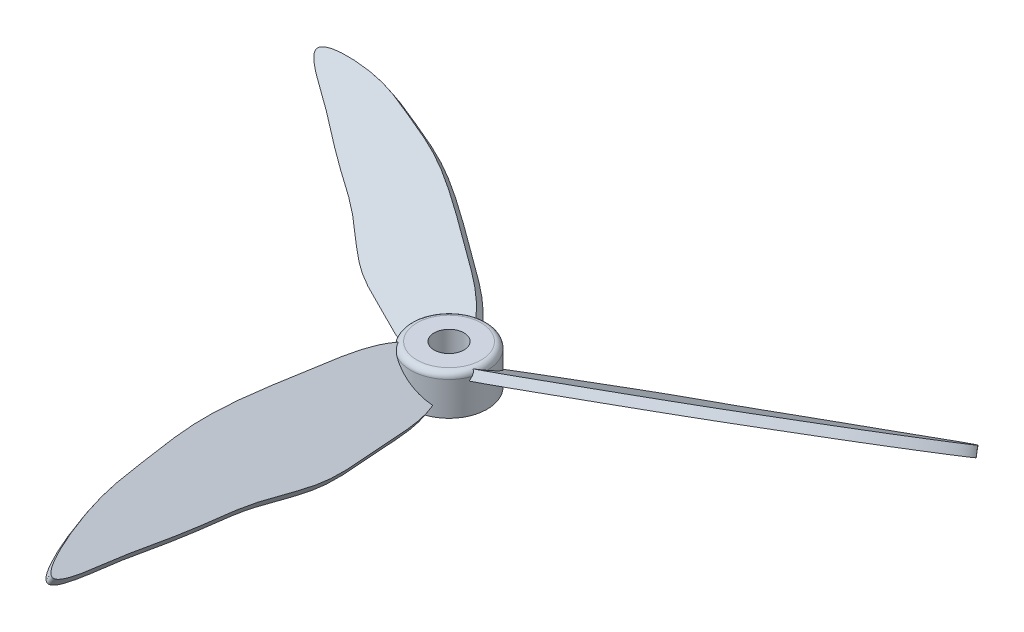
ISO-10303-21;
HEADER;
FILE_DESCRIPTION(('STEP AP214'),'2;1');
FILE_NAME('part.step','',(''),(''),'','','');
FILE_SCHEMA(('AUTOMOTIVE_DESIGN { 1 0 10303 214 1 1 1 1 }'));
ENDSEC;
DATA;
#1=APPLICATION_CONTEXT('core data for automotive mechanical design processes');
#2=APPLICATION_PROTOCOL_DEFINITION('international standard','automotive_design',2000,#1);
#3=PRODUCT_CONTEXT('',#1,'mechanical');
#4=PRODUCT('Part','Part','',(#3));
#5=PRODUCT_RELATED_PRODUCT_CATEGORY('part','',(#4));
#6=PRODUCT_DEFINITION_FORMATION('','',#4);
#7=PRODUCT_DEFINITION_CONTEXT('part definition',#1,'design');
#8=PRODUCT_DEFINITION('design','',#6,#7);
#9=PRODUCT_DEFINITION_SHAPE('','',#8);
#10=(LENGTH_UNIT() NAMED_UNIT(*) SI_UNIT(.MILLI.,.METRE.));
#11=(NAMED_UNIT(*) PLANE_ANGLE_UNIT() SI_UNIT($,.RADIAN.));
#12=(NAMED_UNIT(*) SI_UNIT($,.STERADIAN.) SOLID_ANGLE_UNIT());
#13=UNCERTAINTY_MEASURE_WITH_UNIT(LENGTH_MEASURE(1.E-05),#10,'distance_accuracy_value','');
#14=(GEOMETRIC_REPRESENTATION_CONTEXT(3) GLOBAL_UNCERTAINTY_ASSIGNED_CONTEXT((#13)) GLOBAL_UNIT_ASSIGNED_CONTEXT((#10,
#11,#12)) REPRESENTATION_CONTEXT('',''));
#15=CARTESIAN_POINT('',(0.,0.,0.));
#16=DIRECTION('',(0.,0.,1.));
#17=DIRECTION('',(1.,0.,0.));
#18=AXIS2_PLACEMENT_3D('',#15,#16,#17);
#19=CARTESIAN_POINT('',(0.,6.6,0.));
#20=DIRECTION('',(0.,-1.,0.));
#21=DIRECTION('',(0.,0.,-1.));
#22=AXIS2_PLACEMENT_3D('',#19,#20,#21);
#23=CYLINDRICAL_SURFACE('',#22,6.35);
#24=CARTESIAN_POINT('',(-4.49680921276175,6.96491194591247,4.48343695216304));
#25=CARTESIAN_POINT('',(-4.52350714899534,6.90405572449258,4.45665929181071));
#26=CARTESIAN_POINT('',(-4.54998357817205,6.84321590244583,4.42962555978286));
#27=CARTESIAN_POINT('',(-4.60247920744315,6.72157889389337,4.37505643094239));
#28=CARTESIAN_POINT('',(-4.62849848745034,6.66078170175607,4.34752112355762));
#29=CARTESIAN_POINT('',(-4.72847204521192,6.42514892680272,4.23980440725148));
#30=CARTESIAN_POINT('',(-4.80074566608385,6.25042604326687,4.15780178520276));
#31=CARTESIAN_POINT('',(-4.94125481306203,5.90115444346269,3.98980072588375));
#32=CARTESIAN_POINT('',(-5.00948826873559,5.72660586079776,3.9038002794927));
#33=CARTESIAN_POINT('',(-5.07555734179139,5.55219210498289,3.81591636048113));
#34=B_SPLINE_CURVE_WITH_KNOTS('',3,(#24,#25,#26,#27,#28,#29,#30,#31,#32,#33),.UNSPECIFIED.,.F.,
.F.,(4,2,2,2,4),(0.,0.214938866298417,0.429839778286765,1.04804647547726,1.6665672862245),.UNSPECIFIED.);
#35=CARTESIAN_POINT('',(-4.86124815456972,6.1,4.0854334384117));
#36=VERTEX_POINT('',#35);
#37=CARTESIAN_POINT('',(-5.07555734179139,5.55219210498289,3.81591636048113));
#38=VERTEX_POINT('',#37);
#39=EDGE_CURVE('E136',#36,#38,#34,.T.);
#40=ORIENTED_EDGE('',*,*,#39,.F.);
#41=CARTESIAN_POINT('',(0.,6.1,0.));
#42=DIRECTION('',(0.,1.,0.));
#43=DIRECTION('',(0.,0.,1.));
#44=AXIS2_PLACEMENT_3D('',#41,#42,#43);
#45=CIRCLE('',#44,6.35);
#46=CARTESIAN_POINT('',(-3.18487036983878,6.1,-5.49355083050325));
#47=VERTEX_POINT('',#46);
#48=EDGE_CURVE('E254',#36,#47,#45,.F.);
#49=ORIENTED_EDGE('',*,*,#48,.T.);
#50=CARTESIAN_POINT('',(0.,4.04430390051049,0.));
#51=DIRECTION('',(0.272342210396155,-0.83864109233101,-0.471710545451748));
#52=DIRECTION('',(-0.419320546165509,-0.544684420792306,0.726284490616184));
#53=AXIS2_PLACEMENT_3D('',#50,#51,#52);
#54=ELLIPSE('',#53,7.57177302432214,6.35);
#55=CARTESIAN_POINT('',(-6.3435516702184,2.14520625579199,-0.286098247581657));
#56=VERTEX_POINT('',#55);
#57=EDGE_CURVE('E147',#56,#47,#54,.T.);
#58=ORIENTED_EDGE('',*,*,#57,.F.);
#59=CARTESIAN_POINT('',(-6.25886890307674,0.826112254287706,-1.07194218785298));
#60=CARTESIAN_POINT('',(-6.2663210773202,0.899290521177855,-1.02843043538216));
#61=CARTESIAN_POINT('',(-6.27331337155988,0.972490572230304,-0.984876633269169));
#62=CARTESIAN_POINT('',(-6.28637866662306,1.11891519403977,-0.897710926041318));
#63=CARTESIAN_POINT('',(-6.29245187835954,1.1921397552948,-0.854099036580959));
#64=CARTESIAN_POINT('',(-6.30368225776288,1.33861962922464,-0.766828115727283));
#65=CARTESIAN_POINT('',(-6.30883952989446,1.41187493743623,-0.723169090282081));
#66=CARTESIAN_POINT('',(-6.31824091223512,1.55842293374281,-0.63581564403103));
#67=CARTESIAN_POINT('',(-6.32248502330798,1.63171562180239,-0.592121223258702));
#68=CARTESIAN_POINT('',(-6.33006267628444,1.77834560737756,-0.504709081959201));
#69=CARTESIAN_POINT('',(-6.33339611333917,1.8516829090563,-0.460991359329291));
#70=CARTESIAN_POINT('',(-6.33915485805162,1.99840975805865,-0.373545573427742));
#71=CARTESIAN_POINT('',(-6.3415799578465,2.07179931349502,-0.329817510077791));
#72=CARTESIAN_POINT('',(-6.34355167021854,2.14520625579199,-0.286098247581673));
#73=B_SPLINE_CURVE_WITH_KNOTS('',3,(#59,#60,#61,#62,#63,#64,#65,#66,#67,#68,#69,#70,#71,#72),
.UNSPECIFIED.,.F.,.F.,(4,2,2,2,2,2,4),(0.,0.256386672841968,0.512714420021286,0.769012913712203,
1.02531116496313,1.28163891224845,1.53802528149063),.UNSPECIFIED.);
#74=CARTESIAN_POINT('',(-6.25886890307674,0.826112254287706,-1.07194218785298));
#75=VERTEX_POINT('',#74);
#76=EDGE_CURVE('E309',#75,#56,#73,.T.);
#77=ORIENTED_EDGE('',*,*,#76,.F.);
#78=CARTESIAN_POINT('',(0.,2.25569609948951,0.));
#79=DIRECTION('',(0.272342210396155,-0.83864109233101,-0.471710545451748));
#80=DIRECTION('',(-0.419320546165509,-0.544684420792306,0.726284490616184));
#81=AXIS2_PLACEMENT_3D('',#78,#79,#80);
#82=ELLIPSE('',#81,7.57177302432214,6.35);
#83=CARTESIAN_POINT('',(-0.76690183599759,5.55219210498288,-6.30351977659653));
#84=VERTEX_POINT('',#83);
#85=EDGE_CURVE('E141',#75,#84,#82,.T.);
#86=ORIENTED_EDGE('',*,*,#85,.T.);
#87=CARTESIAN_POINT('',(-1.63436569045816,6.96491194591246,-6.13606949030511));
#88=CARTESIAN_POINT('',(-1.59782658822234,6.90405572449258,-6.14580175113585));
#89=CARTESIAN_POINT('',(-1.56117647493877,6.84321590244582,-6.15521414539046));
#90=CARTESIAN_POINT('',(-1.48767040846498,6.72157889389337,-6.17339212950664));
#91=CARTESIAN_POINT('',(-1.45081449276517,6.66078170175607,-6.18215783328866));
#92=CARTESIAN_POINT('',(-1.30754230115101,6.42514892680272,-6.21487911586382));
#93=CARTESIAN_POINT('',(-1.20038913684392,6.25042604326687,-6.23646859653804));
#94=CARTESIAN_POINT('',(-0.984641378121879,5.90115444346269,-6.27415255762573));
#95=CARTESIAN_POINT('',(-0.876046078973651,5.72660586079775,-6.29024424043151));
#96=CARTESIAN_POINT('',(-0.766901835997591,5.55219210498289,-6.30351977659654));
#97=B_SPLINE_CURVE_WITH_KNOTS('',3,(#87,#88,#89,#90,#91,#92,#93,#94,#95,#96),.UNSPECIFIED.,.F.,
.F.,(4,2,2,2,4),(0.,0.214938866298417,0.429839778286765,1.04804647547726,1.6665672862245),.UNSPECIFIED.);
#98=CARTESIAN_POINT('',(-1.10746506585005,6.1,-6.25268111516346));
#99=VERTEX_POINT('',#98);
#100=EDGE_CURVE('E314',#99,#84,#97,.T.);
#101=ORIENTED_EDGE('',*,*,#100,.F.);
#102=CARTESIAN_POINT('',(0.,6.1,0.));
#103=DIRECTION('',(0.,1.,0.));
#104=DIRECTION('',(0.,0.,1.));
#105=AXIS2_PLACEMENT_3D('',#102,#103,#104);
#106=CIRCLE('',#105,6.35);
#107=CARTESIAN_POINT('',(6.34998976111631,6.1,-0.0114032327890717));
#108=VERTEX_POINT('',#107);
#109=EDGE_CURVE('E251',#99,#108,#106,.F.);
#110=ORIENTED_EDGE('',*,*,#109,.T.);
#111=CARTESIAN_POINT('',(0.,4.04430390051049,0.));
#112=DIRECTION('',(0.272342210396148,-0.83864109233101,0.471710545451752));
#113=DIRECTION('',(-0.419320546165499,-0.544684420792306,-0.72628449061619));
#114=AXIS2_PLACEMENT_3D('',#111,#112,#113);
#115=ELLIPSE('',#114,7.57177302432214,6.35);
#116=CARTESIAN_POINT('',(3.41954418549315,2.14520625579199,-5.3506277728375));
#117=VERTEX_POINT('',#116);
#118=EDGE_CURVE('E209',#117,#108,#115,.T.);
#119=ORIENTED_EDGE('',*,*,#118,.F.);
#120=CARTESIAN_POINT('',(4.05776361760734,0.826112254287706,-4.88436837509439));
#121=CARTESIAN_POINT('',(4.02380742172617,0.899290521177854,-4.91257802353807));
#122=CARTESIAN_POINT('',(3.98958486978475,0.972490572230304,-4.94041042903686));
#123=CARTESIAN_POINT('',(3.92062980051819,1.11891519403977,-4.99530816008344));
#124=CARTESIAN_POINT('',(3.88589740220672,1.1921397552948,-5.02237366045997));
#125=CARTESIAN_POINT('',(3.81593375743744,1.33861962922464,-5.07573491474424));
#126=CARTESIAN_POINT('',(3.78070256836322,1.41187493743622,-5.10203075614702));
#127=CARTESIAN_POINT('',(3.70975295597202,1.55842293374281,-5.15384931521025));
#128=CARTESIAN_POINT('',(3.67403453311597,1.63171562180239,-5.17937203360199));
#129=CARTESIAN_POINT('',(3.60212222463964,1.77834560737756,-5.22964054423042));
#130=CARTESIAN_POINT('',(3.5659282847739,1.8516829090563,-5.25438624671669));
#131=CARTESIAN_POINT('',(3.49307738508548,1.99840975805865,-5.30309635888235));
#132=CARTESIAN_POINT('',(3.45642032126357,2.07179931349502,-5.32706058858641));
#133=CARTESIAN_POINT('',(3.41954418549323,2.14520625579199,-5.35062777283761));
#134=B_SPLINE_CURVE_WITH_KNOTS('',3,(#120,#121,#122,#123,#124,#125,#126,#127,#128,#129,#130,
#131,#132,#133),.UNSPECIFIED.,.F.,.F.,(4,2,2,2,2,2,4),(0.,0.256386672841969,0.512714420021286,
0.769012913712203,1.02531116496313,1.28163891224845,1.53802528149062),.UNSPECIFIED.);
#135=CARTESIAN_POINT('',(4.05776361760734,0.826112254287706,-4.88436837509439));
#136=VERTEX_POINT('',#135);
#137=EDGE_CURVE('E230',#136,#117,#134,.T.);
#138=ORIENTED_EDGE('',*,*,#137,.F.);
#139=CARTESIAN_POINT('',(0.,2.25569609948951,0.));
#140=DIRECTION('',(0.272342210396148,-0.83864109233101,0.471710545451752));
#141=DIRECTION('',(-0.419320546165499,-0.544684420792306,-0.72628449061619));
#142=AXIS2_PLACEMENT_3D('',#139,#140,#141);
#143=ELLIPSE('',#142,7.57177302432214,6.35);
#144=CARTESIAN_POINT('',(5.84245917778898,5.55219210498289,2.48760341611545));
#145=VERTEX_POINT('',#144);
#146=EDGE_CURVE('E293',#136,#145,#143,.T.);
#147=ORIENTED_EDGE('',*,*,#146,.T.);
#148=CARTESIAN_POINT('',(6.13117490321993,6.96491194591246,1.65263253814212));
#149=CARTESIAN_POINT('',(6.12133373721769,6.90405572449258,1.68914245932519));
#150=CARTESIAN_POINT('',(6.11116005311083,6.84321590244582,1.72558858560764));
#151=CARTESIAN_POINT('',(6.09014961590815,6.72157889389337,1.7983356985643));
#152=CARTESIAN_POINT('',(6.07931298021552,6.66078170175607,1.83463670973109));
#153=CARTESIAN_POINT('',(6.03601434636295,6.42514892680272,1.9750747086124));
#154=CARTESIAN_POINT('',(6.00113480292778,6.25042604326687,2.07866681133533));
#155=CARTESIAN_POINT('',(5.92589619118391,5.90115444346269,2.28435183174202));
#156=CARTESIAN_POINT('',(5.88553434770925,5.72660586079775,2.38644396093885));
#157=CARTESIAN_POINT('',(5.84245917778899,5.55219210498289,2.48760341611545));
#158=B_SPLINE_CURVE_WITH_KNOTS('',3,(#148,#149,#150,#151,#152,#153,#154,#155,#156,#157),
.UNSPECIFIED.,.F.,.F.,(4,2,2,2,4),(0.,0.214938866298415,0.429839778286762,1.04804647547726,
1.6665672862245),.UNSPECIFIED.);
#159=CARTESIAN_POINT('',(5.96871322041978,6.1,2.1672476767518));
#160=VERTEX_POINT('',#159);
#161=EDGE_CURVE('E238',#160,#145,#158,.T.);
#162=ORIENTED_EDGE('',*,*,#161,.F.);
#163=CARTESIAN_POINT('',(0.,6.1,0.));
#164=DIRECTION('',(0.,1.,0.));
#165=DIRECTION('',(0.,0.,1.));
#166=AXIS2_PLACEMENT_3D('',#163,#164,#165);
#167=CIRCLE('',#166,6.35);
#168=CARTESIAN_POINT('',(-3.1651193912775,6.1,5.50495406329237));
#169=VERTEX_POINT('',#168);
#170=EDGE_CURVE('E125',#160,#169,#167,.F.);
#171=ORIENTED_EDGE('',*,*,#170,.T.);
#172=CARTESIAN_POINT('',(0.,4.04430390051049,0.));
#173=DIRECTION('',(-0.544684420792306,-0.83864109233101,0.));
#174=DIRECTION('',(0.838641092331011,-0.544684420792306,0.));
#175=AXIS2_PLACEMENT_3D('',#172,#173,#174);
#176=ELLIPSE('',#175,7.57177302432214,6.35);
#177=CARTESIAN_POINT('',(2.9240074847253,2.14520625579199,5.63672602041916));
#178=VERTEX_POINT('',#177);
#179=EDGE_CURVE('E117',#178,#169,#176,.T.);
#180=ORIENTED_EDGE('',*,*,#179,.F.);
#181=CARTESIAN_POINT('',(2.20110528546944,0.826112254287706,5.95631056294738));
#182=CARTESIAN_POINT('',(2.24251365559408,0.899290521177854,5.94100845892024));
#183=CARTESIAN_POINT('',(2.28372850177518,0.972490572230304,5.92528706230604));
#184=CARTESIAN_POINT('',(2.36574886610492,1.11891519403977,5.89301908612476));
#185=CARTESIAN_POINT('',(2.40655447615287,1.1921397552948,5.87647269704094));
#186=CARTESIAN_POINT('',(2.48774850032549,1.33861962922464,5.84256303047153));
#187=CARTESIAN_POINT('',(2.52813696153129,1.41187493743623,5.82519984642911));
#188=CARTESIAN_POINT('',(2.60848795626315,1.55842293374281,5.78966495924129));
#189=CARTESIAN_POINT('',(2.64845049019206,1.63171562180239,5.77149325686069));
#190=CARTESIAN_POINT('',(2.72794045164486,1.77834560737756,5.73434962618963));
#191=CARTESIAN_POINT('',(2.76746782856533,1.8516829090563,5.71537760604598));
#192=CARTESIAN_POINT('',(2.84607747296619,1.99840975805865,5.6766419323101));
#193=CARTESIAN_POINT('',(2.88515963658298,2.07179931349502,5.6568780986642));
#194=CARTESIAN_POINT('',(2.92400748472536,2.14520625579199,5.63672602041929));
#195=B_SPLINE_CURVE_WITH_KNOTS('',3,(#181,#182,#183,#184,#185,#186,#187,#188,#189,#190,#191,
#192,#193,#194),.UNSPECIFIED.,.F.,.F.,(4,2,2,2,2,2,4),(0.,0.256386672841969,0.512714420021287,
0.769012913712204,1.02531116496313,1.28163891224845,1.53802528149063),.UNSPECIFIED.);
#196=CARTESIAN_POINT('',(2.20110528546944,0.826112254287706,5.95631056294738));
#197=VERTEX_POINT('',#196);
#198=EDGE_CURVE('E121',#197,#178,#195,.T.);
#199=ORIENTED_EDGE('',*,*,#198,.F.);
#200=CARTESIAN_POINT('',(0.,2.25569609948951,0.));
#201=DIRECTION('',(-0.544684420792306,-0.83864109233101,0.));
#202=DIRECTION('',(0.838641092331011,-0.544684420792306,0.));
#203=AXIS2_PLACEMENT_3D('',#200,#201,#202);
#204=ELLIPSE('',#203,7.57177302432214,6.35);
#205=EDGE_CURVE('E129',#197,#38,#204,.T.);
#206=ORIENTED_EDGE('',*,*,#205,.T.);
#207=EDGE_LOOP('',(#40,#49,#58,#77,#86,#101,#110,#119,#138,#147,#162,#171,#180,#199,#206));
#208=FACE_BOUND('',#207,.T.);
#209=CARTESIAN_POINT('',(0.,0.5,0.));
#210=DIRECTION('',(0.,-1.,0.));
#211=DIRECTION('',(0.,0.,-1.));
#212=AXIS2_PLACEMENT_3D('',#209,#210,#211);
#213=CIRCLE('',#212,6.35);
#214=CARTESIAN_POINT('',(0.,0.5,-6.35));
#215=VERTEX_POINT('',#214);
#216=EDGE_CURVE('E194',#215,#215,#213,.T.);
#217=ORIENTED_EDGE('',*,*,#216,.F.);
#218=EDGE_LOOP('',(#217));
#219=FACE_BOUND('',#218,.T.);
#220=ADVANCED_FACE('F39',(#208,#219),#23,.T.);
#221=CARTESIAN_POINT('',(0.,6.6,0.));
#222=DIRECTION('',(0.,-1.,0.));
#223=DIRECTION('',(0.,0.,-1.));
#224=AXIS2_PLACEMENT_3D('',#221,#222,#223);
#225=CYLINDRICAL_SURFACE('',#224,2.48);
#226=CARTESIAN_POINT('',(0.,7.1,0.));
#227=DIRECTION('',(0.,1.,0.));
#228=DIRECTION('',(0.,0.,1.));
#229=AXIS2_PLACEMENT_3D('',#226,#227,#228);
#230=CIRCLE('',#229,2.48);
#231=CARTESIAN_POINT('',(0.,7.1,2.48));
#232=VERTEX_POINT('',#231);
#233=EDGE_CURVE('E188',#232,#232,#230,.T.);
#234=ORIENTED_EDGE('',*,*,#233,.T.);
#235=EDGE_LOOP('',(#234));
#236=FACE_BOUND('',#235,.T.);
#237=CARTESIAN_POINT('',(0.,0.5,0.));
#238=DIRECTION('',(0.,-1.,0.));
#239=DIRECTION('',(0.,0.,-1.));
#240=AXIS2_PLACEMENT_3D('',#237,#238,#239);
#241=CIRCLE('',#240,2.48);
#242=CARTESIAN_POINT('',(0.,0.5,-2.48));
#243=VERTEX_POINT('',#242);
#244=EDGE_CURVE('E191',#243,#243,#241,.T.);
#245=ORIENTED_EDGE('',*,*,#244,.T.);
#246=EDGE_LOOP('',(#245));
#247=FACE_BOUND('',#246,.T.);
#248=ADVANCED_FACE('F175',(#236,#247),#225,.F.);
#249=CARTESIAN_POINT('',(0.540459625054596,1.90467593063962,2.48));
#250=CARTESIAN_POINT('',(2.99619891259537,0.309711238731691,5.74465080068534));
#251=CARTESIAN_POINT('',(2.80702486837476,0.432576855081163,13.7980960293343));
#252=CARTESIAN_POINT('',(3.87111819792663,-0.258535307411293,24.9409262527551));
#253=CARTESIAN_POINT('',(1.32088405221407,1.39780233361851,34.5514533349964));
#254=CARTESIAN_POINT('',(0.920058609821834,1.65813226012069,45.1577543367423));
#255=CARTESIAN_POINT('',(-0.462750395161342,2.55624532521286,53.5063508872358));
#256=CARTESIAN_POINT('',(-1.34187672447769,3.12722428136678,70.5180124952561));
#257=CARTESIAN_POINT('',(-6.72773150216865,6.62525367306297,54.0037365760425));
#258=CARTESIAN_POINT('',(-7.46388496251162,7.10337396173933,45.1581331672322));
#259=CARTESIAN_POINT('',(-8.59454475000488,7.8377200092865,34.7170479360904));
#260=CARTESIAN_POINT('',(-8.03353875488307,7.47335529080532,24.737446292408));
#261=CARTESIAN_POINT('',(-6.94186189629165,6.7643280527511,13.8743813386575));
#262=CARTESIAN_POINT('',(-6.24958598714634,6.31470555505878,6.13302672519523));
#263=CARTESIAN_POINT('',(-4.5074262061621,5.18319971792469,2.48));
#264=B_SPLINE_CURVE_WITH_KNOTS('',3,(#249,#250,#251,#252,#253,#254,#255,#256,#257,#258,#259,
#260,#261,#262,#263),.UNSPECIFIED.,.F.,.F.,(4,1,1,1,1,1,1,1,1,1,1,1,4),(0.,0.101832444077848,
0.179576892830302,0.259315309304814,0.337678690693089,0.416376573721109,0.496114990195621,
0.585949308671478,0.665353804356123,0.743532020461186,0.821338584033298,0.899701965421574,1.),.UNSPECIFIED.);
#265=DIRECTION('',(0.544684420792306,0.83864109233101,0.));
#266=VECTOR('',#265,1.);
#267=SURFACE_OF_LINEAR_EXTRUSION('',#264,#266);
#268=CARTESIAN_POINT('',(1.35748625624305,3.16263756913613,2.48));
#269=CARTESIAN_POINT('',(3.81322554378383,1.56767287722821,5.74465080068534));
#270=CARTESIAN_POINT('',(3.62405149956321,1.69053849357768,13.7980960293343));
#271=CARTESIAN_POINT('',(4.68814482911509,0.999426331085222,24.9409262527551));
#272=CARTESIAN_POINT('',(2.13791068340253,2.65576397211503,34.5514533349964));
#273=CARTESIAN_POINT('',(1.73708524101029,2.91609389861721,45.1577543367423));
#274=CARTESIAN_POINT('',(0.354276236027117,3.81420696370937,53.5063508872358));
#275=CARTESIAN_POINT('',(-0.524850093289236,4.38518591986329,70.5180124952561));
#276=CARTESIAN_POINT('',(-5.91070487098019,7.88321531155948,54.0037365760425));
#277=CARTESIAN_POINT('',(-6.64685833132316,8.36133560023584,45.1581331672322));
#278=CARTESIAN_POINT('',(-7.77751811881642,9.09568164778301,34.7170479360904));
#279=CARTESIAN_POINT('',(-7.21651212369461,8.73131692930183,24.737446292408));
#280=CARTESIAN_POINT('',(-6.12483526510319,8.02228969124761,13.8743813386575));
#281=CARTESIAN_POINT('',(-5.43255935595788,7.5726671935553,6.13302672519523));
#282=CARTESIAN_POINT('',(-3.69039957497364,6.44116135642121,2.48));
#283=B_SPLINE_CURVE_WITH_KNOTS('',3,(#268,#269,#270,#271,#272,#273,#274,#275,#276,#277,#278,
#279,#280,#281,#282),.UNSPECIFIED.,.F.,.F.,(4,1,1,1,1,1,1,1,1,1,1,1,4),(0.,0.101832444077848,
0.179576892830302,0.259315309304814,0.337678690693089,0.416376573721109,0.496114990195621,
0.585949308671478,0.665353804356123,0.743532020461186,0.821338584033298,0.899701965421574,1.),.UNSPECIFIED.);
#284=CARTESIAN_POINT('',(-4.36057303182291,6.87642865313774,4.09246339228433));
#285=VERTEX_POINT('',#284);
#286=EDGE_CURVE('E60',#178,#285,#283,.T.);
#287=ORIENTED_EDGE('',*,*,#286,.T.);
#288=CARTESIAN_POINT('',(-4.36057303182593,6.8764286531397,4.09246339229271));
#289=CARTESIAN_POINT('',(-4.37685186614719,6.86041905271235,4.10394444146547));
#290=CARTESIAN_POINT('',(-4.39308416140749,6.84370903915227,4.11447915046655));
#291=CARTESIAN_POINT('',(-4.4253427055797,6.8090500365288,4.13361234333104));
#292=CARTESIAN_POINT('',(-4.44136907232567,6.79110179720284,4.14221198565117));
#293=CARTESIAN_POINT('',(-4.48870803581137,6.73595138562813,4.16492231921106));
#294=CARTESIAN_POINT('',(-4.51958272710175,6.69714420979054,4.17615597405298));
#295=CARTESIAN_POINT('',(-4.57923903426934,6.61675796741035,4.19092254606485));
#296=CARTESIAN_POINT('',(-4.60802452002563,6.5751843141939,4.19447007150007));
#297=CARTESIAN_POINT('',(-4.66313009848443,6.49024382194392,4.19434763463968));
#298=CARTESIAN_POINT('',(-4.68944028142481,6.44687070012625,4.19064985582069));
#299=CARTESIAN_POINT('',(-4.74306951556079,6.35250157450686,4.17545454425911));
#300=CARTESIAN_POINT('',(-4.76986964296792,6.3014020221003,4.16279766350791));
#301=CARTESIAN_POINT('',(-4.81895925485805,6.19992562883239,4.12966892987967));
#302=CARTESIAN_POINT('',(-4.8412726305013,6.14954636291509,4.1092402409981));
#303=CARTESIAN_POINT('',(-4.86124815456972,6.1,4.0854334384117));
#304=B_SPLINE_CURVE_WITH_KNOTS('',3,(#288,#289,#290,#291,#292,#293,#294,#295,#296,#297,#298,
#299,#300,#301,#302,#303),.UNSPECIFIED.,.F.,.F.,(4,2,2,2,2,2,2,4),(0.,0.0766121470129687,
0.153178306260515,0.304905813670958,0.456344693732504,0.608366124608582,0.784850073667501,
0.960367825801237),.UNSPECIFIED.);
#305=EDGE_CURVE('E11',#285,#36,#304,.T.);
#306=ORIENTED_EDGE('',*,*,#305,.T.);
#307=ORIENTED_EDGE('',*,*,#39,.T.);
#308=EDGE_CURVE('E130',#197,#38,#264,.T.);
#309=ORIENTED_EDGE('',*,*,#308,.F.);
#310=ORIENTED_EDGE('',*,*,#198,.T.);
#311=EDGE_LOOP('',(#287,#306,#307,#309,#310));
#312=FACE_BOUND('',#311,.T.);
#313=ADVANCED_FACE('F133',(#312),#267,.F.);
#314=CARTESIAN_POINT('',(-2.4179728139127,1.90467593063962,-0.771948234982919));
#315=CARTESIAN_POINT('',(-6.4731129855618,0.309711238731691,-0.277541027243796));
#316=CARTESIAN_POINT('',(-13.353014119448,0.432576855081163,-4.46809316959998));
#317=CARTESIAN_POINT('',(-23.5350348277634,-0.258535307411293,-9.11797642592095));
#318=CARTESIAN_POINT('',(-30.5828783518864,1.39780233361851,-16.1318075228272));
#319=CARTESIAN_POINT('',(-39.5677917383865,1.65813226012069,-21.782083039295));
#320=CARTESIAN_POINT('',(-46.1064839345694,2.55624532521286,-27.1539290414391));
#321=CARTESIAN_POINT('',(-60.3994518830413,3.12722428136678,-36.4211055797731));
#322=CARTESIAN_POINT('',(-43.4047420230512,6.62525367306296,-32.8282546787404));
#323=CARTESIAN_POINT('',(-35.3761480290478,7.10337396173933,-29.042980572076));
#324=CARTESIAN_POINT('',(-25.7685730820538,7.8377200092865,-24.8016180555117));
#325=CARTESIAN_POINT('',(-17.4064875365369,7.47335529080532,-19.3259717902196));
#326=CARTESIAN_POINT('',(-8.54463575292425,6.7643280527511,-12.9490194210806));
#327=CARTESIAN_POINT('',(-2.18656395253474,6.31470555505878,-8.4788135906016));
#328=CARTESIAN_POINT('',(0.105970101695665,5.18319971792469,-5.14354560022009));
#329=B_SPLINE_CURVE_WITH_KNOTS('',3,(#314,#315,#316,#317,#318,#319,#320,#321,#322,#323,#324,
#325,#326,#327,#328),.UNSPECIFIED.,.F.,.F.,(4,1,1,1,1,1,1,1,1,1,1,1,4),(0.,0.101832444077848,
0.179576892830302,0.259315309304814,0.337678690693089,0.416376573721109,0.496114990195621,
0.585949308671478,0.665353804356123,0.743532020461186,0.821338584033298,0.899701965421574,1.),.UNSPECIFIED.);
#330=DIRECTION('',(-0.272342210396155,0.83864109233101,0.471710545451748));
#331=VECTOR('',#330,1.);
#332=SURFACE_OF_LINEAR_EXTRUSION('',#329,#331);
#333=CARTESIAN_POINT('',(-2.82648612950694,3.16263756913613,-0.0643824168052964));
#334=CARTESIAN_POINT('',(-6.88162630115604,1.56767287722821,0.430024790933827));
#335=CARTESIAN_POINT('',(-13.7615274350423,1.69053849357768,-3.76052735142236));
#336=CARTESIAN_POINT('',(-23.9435481433576,0.999426331085223,-8.41041060774333));
#337=CARTESIAN_POINT('',(-30.9913916674807,2.65576397211503,-15.4242417046496));
#338=CARTESIAN_POINT('',(-39.9763050539808,2.91609389861721,-21.0745172211174));
#339=CARTESIAN_POINT('',(-46.5149972501636,3.81420696370937,-26.4463632232615));
#340=CARTESIAN_POINT('',(-60.8079651986355,4.38518591986329,-35.7135397615955));
#341=CARTESIAN_POINT('',(-43.8132553386454,7.88321531155948,-32.1206888605627));
#342=CARTESIAN_POINT('',(-35.784661344642,8.36133560023584,-28.3354147538984));
#343=CARTESIAN_POINT('',(-26.1770863976481,9.09568164778301,-24.0940522373341));
#344=CARTESIAN_POINT('',(-17.8150008521311,8.73131692930183,-18.618405972042));
#345=CARTESIAN_POINT('',(-8.95314906851848,8.02228969124761,-12.2414536029029));
#346=CARTESIAN_POINT('',(-2.59507726812897,7.5726671935553,-7.77124777242398));
#347=CARTESIAN_POINT('',(-0.302543213898567,6.44116135642121,-4.43597978204247));
#348=B_SPLINE_CURVE_WITH_KNOTS('',3,(#333,#334,#335,#336,#337,#338,#339,#340,#341,#342,#343,
#344,#345,#346,#347),.UNSPECIFIED.,.F.,.F.,(4,1,1,1,1,1,1,1,1,1,1,1,4),(0.,0.101832444077848,
0.179576892830302,0.259315309304814,0.337678690693089,0.416376573721109,0.496114990195621,
0.585949308671478,0.665353804356123,0.743532020461186,0.821338584033298,0.899701965421574,1.),.UNSPECIFIED.);
#349=CARTESIAN_POINT('',(-1.36389074586459,6.87642865313774,-5.82259871675814));
#350=VERTEX_POINT('',#349);
#351=EDGE_CURVE('E292',#56,#350,#348,.T.);
#352=ORIENTED_EDGE('',*,*,#351,.T.);
#353=CARTESIAN_POINT('',(-1.36389074587034,6.8764286531397,-5.82259871676495));
#354=CARTESIAN_POINT('',(-1.36569420895542,6.86041905271235,-5.84243712541754));
#355=CARTESIAN_POINT('',(-1.36670138694168,6.84370903915227,-5.86176205997523));
#356=CARTESIAN_POINT('',(-1.36714194593172,6.80905003652879,-5.89926537514971));
#357=CARTESIAN_POINT('',(-1.36657627127144,6.79110179720283,-5.91744443704215));
#358=CARTESIAN_POINT('',(-1.36257451531986,6.73595138562812,-5.96979634878953));
#359=CARTESIAN_POINT('',(-1.35686580014513,6.69714420979053,-6.00215144320197));
#360=CARTESIAN_POINT('',(-1.33982587305042,6.61675796741035,-6.061198606711));
#361=CARTESIAN_POINT('',(-1.32850537731975,6.5751843141939,-6.08790133135383));
#362=CARTESIAN_POINT('',(-1.30084655465889,6.49024382194392,-6.13556294375919));
#363=CARTESIAN_POINT('',(-1.28448909279388,6.44687070012625,-6.15649934115428));
#364=CARTESIAN_POINT('',(-1.24451494989514,6.35250157450686,-6.19534596452076));
#365=CARTESIAN_POINT('',(-1.22015370592837,6.3014020221003,-6.21222711530439));
#366=CARTESIAN_POINT('',(-1.16691857506604,6.19992562883239,-6.23817559944904));
#367=CARTESIAN_POINT('',(-1.13807012370697,6.14954636291509,-6.24728520515949));
#368=CARTESIAN_POINT('',(-1.10746506585005,6.1,-6.25268111516346));
#369=B_SPLINE_CURVE_WITH_KNOTS('',3,(#353,#354,#355,#356,#357,#358,#359,#360,#361,#362,#363,
#364,#365,#366,#367,#368),.UNSPECIFIED.,.F.,.F.,(4,2,2,2,2,2,2,4),(0.,0.0766121470129706,
0.153178306260517,0.304905813670961,0.456344693732506,0.608366124608584,0.784850073667499,
0.960367825801234),.UNSPECIFIED.);
#370=EDGE_CURVE('E266',#350,#99,#369,.T.);
#371=ORIENTED_EDGE('',*,*,#370,.T.);
#372=ORIENTED_EDGE('',*,*,#100,.T.);
#373=EDGE_CURVE('E284',#75,#84,#329,.T.);
#374=ORIENTED_EDGE('',*,*,#373,.F.);
#375=ORIENTED_EDGE('',*,*,#76,.T.);
#376=EDGE_LOOP('',(#352,#371,#372,#374,#375));
#377=FACE_BOUND('',#376,.T.);
#378=ADVANCED_FACE('F174',(#377),#332,.F.);
#379=CARTESIAN_POINT('',(1.87751318885813,1.90467593063962,-1.70805176501708));
#380=CARTESIAN_POINT('',(3.47691407296648,0.309711238731691,-5.46710977344154));
#381=CARTESIAN_POINT('',(10.5459892510734,0.432576855081163,-9.33000285973424));
#382=CARTESIAN_POINT('',(19.663916629837,-0.258535307411293,-15.8229498268341));
#383=CARTESIAN_POINT('',(29.2619942996726,1.39780233361851,-18.4196458121691));
#384=CARTESIAN_POINT('',(38.647733128565,1.65813226012069,-23.3756712974471));
#385=CARTESIAN_POINT('',(46.5692343297311,2.55624532521286,-26.3524218457964));
#386=CARTESIAN_POINT('',(61.7413286075195,3.12722428136678,-34.0969069154828));
#387=CARTESIAN_POINT('',(50.1324735252202,6.62525367306296,-21.1754818973019));
#388=CARTESIAN_POINT('',(42.8400329915597,7.10337396173933,-16.115152595156));
#389=CARTESIAN_POINT('',(34.3631178320589,7.8377200092865,-9.91542988057847));
#390=CARTESIAN_POINT('',(25.4400262914201,7.47335529080532,-5.41147450218823));
#391=CARTESIAN_POINT('',(15.486497649216,6.7643280527511,-0.925361917576816));
#392=CARTESIAN_POINT('',(8.4361499396811,6.31470555505878,2.34578686540644));
#393=CARTESIAN_POINT('',(4.40145610446643,5.18319971792469,2.66354560022013));
#394=B_SPLINE_CURVE_WITH_KNOTS('',3,(#379,#380,#381,#382,#383,#384,#385,#386,#387,#388,#389,
#390,#391,#392,#393),.UNSPECIFIED.,.F.,.F.,(4,1,1,1,1,1,1,1,1,1,1,1,4),(0.,0.101832444077848,
0.179576892830302,0.259315309304814,0.337678690693089,0.416376573721109,0.496114990195621,
0.585949308671478,0.665353804356123,0.743532020461186,0.821338584033298,0.899701965421574,1.),.UNSPECIFIED.);
#395=DIRECTION('',(-0.272342210396149,0.83864109233101,-0.471710545451752));
#396=VECTOR('',#395,1.);
#397=SURFACE_OF_LINEAR_EXTRUSION('',#394,#396);
#398=CARTESIAN_POINT('',(1.4689998732639,3.16263756913613,-2.4156175831947));
#399=CARTESIAN_POINT('',(3.06840075737226,1.56767287722821,-6.17467559161917));
#400=CARTESIAN_POINT('',(10.1374759354791,1.69053849357768,-10.0375686779119));
#401=CARTESIAN_POINT('',(19.2554033142427,0.999426331085223,-16.5305156450117));
#402=CARTESIAN_POINT('',(28.8534809840784,2.65576397211503,-19.1272116303467));
#403=CARTESIAN_POINT('',(38.2392198129708,2.91609389861721,-24.0832371156247));
#404=CARTESIAN_POINT('',(46.1607210141369,3.81420696370937,-27.0599876639741));
#405=CARTESIAN_POINT('',(61.3328152919252,4.38518591986329,-34.8044727336604));
#406=CARTESIAN_POINT('',(49.723960209626,7.88321531155948,-21.8830477154795));
#407=CARTESIAN_POINT('',(42.4315196759654,8.36133560023584,-16.8227184133336));
#408=CARTESIAN_POINT('',(33.9546045164647,9.09568164778301,-10.6229956987561));
#409=CARTESIAN_POINT('',(25.0315129758259,8.73131692930183,-6.11904032036586));
#410=CARTESIAN_POINT('',(15.0779843336217,8.02228969124761,-1.63292773575444));
#411=CARTESIAN_POINT('',(8.02763662408687,7.5726671935553,1.63822104722882));
#412=CARTESIAN_POINT('',(3.99294278887221,6.44116135642121,1.9559797820425));
#413=B_SPLINE_CURVE_WITH_KNOTS('',3,(#398,#399,#400,#401,#402,#403,#404,#405,#406,#407,#408,
#409,#410,#411,#412),.UNSPECIFIED.,.F.,.F.,(4,1,1,1,1,1,1,1,1,1,1,1,4),(0.,0.101832444077848,
0.179576892830302,0.259315309304814,0.337678690693089,0.416376573721109,0.496114990195621,
0.585949308671478,0.665353804356123,0.743532020461186,0.821338584033298,0.899701965421574,1.),.UNSPECIFIED.);
#414=CARTESIAN_POINT('',(5.72446377768751,6.87642865313774,1.73013532447386));
#415=VERTEX_POINT('',#414);
#416=EDGE_CURVE('E68',#117,#415,#413,.T.);
#417=ORIENTED_EDGE('',*,*,#416,.T.);
#418=CARTESIAN_POINT('',(5.72446377769627,6.8764286531397,1.73013532447228));
#419=CARTESIAN_POINT('',(5.74254607510262,6.86041905271235,1.73849268395211));
#420=CARTESIAN_POINT('',(5.75978554834918,6.84370903915227,1.74728290950872));
#421=CARTESIAN_POINT('',(5.79248465151144,6.8090500365288,1.76565303181872));
#422=CARTESIAN_POINT('',(5.80794534359712,6.79110179720283,1.77523245139102));
#423=CARTESIAN_POINT('',(5.85128255113124,6.73595138562813,1.80487402957852));
#424=CARTESIAN_POINT('',(5.87644852724689,6.69714420979053,1.82599546914903));
#425=CARTESIAN_POINT('',(5.91906490731977,6.61675796741035,1.8702760606462));
#426=CARTESIAN_POINT('',(5.93652989734539,6.5751843141939,1.89343125985381));
#427=CARTESIAN_POINT('',(5.96397665314333,6.49024382194392,1.94121530911956));
#428=CARTESIAN_POINT('',(5.9739293742187,6.44687070012625,1.96584948533364));
#429=CARTESIAN_POINT('',(5.98758446545594,6.35250157450686,2.0198914202617));
#430=CARTESIAN_POINT('',(5.99002334889629,6.3014020221003,2.04942945179652));
#431=CARTESIAN_POINT('',(5.9858778299241,6.19992562883239,2.10850666956942));
#432=CARTESIAN_POINT('',(5.97934275420827,6.14954636291509,2.13804496416144));
#433=CARTESIAN_POINT('',(5.96871322041978,6.1,2.1672476767518));
#434=B_SPLINE_CURVE_WITH_KNOTS('',3,(#418,#419,#420,#421,#422,#423,#424,#425,#426,#427,#428,
#429,#430,#431,#432,#433),.UNSPECIFIED.,.F.,.F.,(4,2,2,2,2,2,2,4),(0.,0.0766121470129689,
0.153178306260515,0.304905813670959,0.456344693732503,0.608366124608582,0.7848500736675,
0.960367825801236),.UNSPECIFIED.);
#435=EDGE_CURVE('E433',#415,#160,#434,.T.);
#436=ORIENTED_EDGE('',*,*,#435,.T.);
#437=ORIENTED_EDGE('',*,*,#161,.T.);
#438=EDGE_CURVE('E202',#136,#145,#394,.T.);
#439=ORIENTED_EDGE('',*,*,#438,.F.);
#440=ORIENTED_EDGE('',*,*,#137,.T.);
#441=EDGE_LOOP('',(#417,#436,#437,#439,#440));
#442=FACE_BOUND('',#441,.T.);
#443=ADVANCED_FACE('F217',(#442),#397,.F.);
#444=CARTESIAN_POINT('',(-1.31253645753106,4.89677603272139,64.7941905889615));
#445=DIRECTION('',(-0.544684420792306,-0.83864109233101,0.));
#446=DIRECTION('',(0.838641092331011,-0.544684420792306,0.));
#447=AXIS2_PLACEMENT_3D('',#444,#445,#446);
#448=PLANE('',#447);
#449=ORIENTED_EDGE('',*,*,#179,.T.);
#450=CARTESIAN_POINT('',(-3.1651193912775,6.1,5.50495406329237));
#451=CARTESIAN_POINT('',(-3.22644181560379,6.13982796631502,5.46967844100211));
#452=CARTESIAN_POINT('',(-3.28637818304736,6.17875571011857,5.43112825807117));
#453=CARTESIAN_POINT('',(-3.40323106016003,6.25464984679999,5.34811998205494));
#454=CARTESIAN_POINT('',(-3.46015032853551,6.291618031415,5.30366742093982));
#455=CARTESIAN_POINT('',(-3.62363674015059,6.39779992761861,5.16447236955265));
#456=CARTESIAN_POINT('',(-3.7257611049346,6.46412812330307,5.06221244919633));
#457=CARTESIAN_POINT('',(-3.92783687332244,6.59537320998795,4.8282181374564));
#458=CARTESIAN_POINT('',(-4.026094842895,6.65919024177219,4.69442660739118));
#459=CARTESIAN_POINT('',(-4.20680589255315,6.77655927402439,4.4069436296322));
#460=CARTESIAN_POINT('',(-4.28878596427324,6.82980406287352,4.25282792206258));
#461=CARTESIAN_POINT('',(-4.36057303182599,6.87642865313975,4.09246339229279));
#462=B_SPLINE_CURVE_WITH_KNOTS('',3,(#450,#451,#452,#453,#454,#455,#456,#457,#458,#459,#460,
#461),.UNSPECIFIED.,.F.,.F.,(4,2,2,2,2,4),(0.,0.243363255175869,0.486500008673544,
0.961604542151823,1.49304285780132,2.03818815207438),.UNSPECIFIED.);
#463=EDGE_CURVE('E54',#169,#285,#462,.T.);
#464=ORIENTED_EDGE('',*,*,#463,.T.);
#465=ORIENTED_EDGE('',*,*,#286,.F.);
#466=EDGE_LOOP('',(#449,#464,#465));
#467=FACE_BOUND('',#466,.T.);
#468=ADVANCED_FACE('F138',(#467),#448,.F.);
#469=CARTESIAN_POINT('',(-2.12956308871952,3.63881439422487,64.7941905889615));
#470=DIRECTION('',(-0.544684420792306,-0.83864109233101,0.));
#471=DIRECTION('',(0.838641092331011,-0.544684420792306,0.));
#472=AXIS2_PLACEMENT_3D('',#469,#470,#471);
#473=PLANE('',#472);
#474=ORIENTED_EDGE('',*,*,#205,.F.);
#475=ORIENTED_EDGE('',*,*,#308,.T.);
#476=EDGE_LOOP('',(#474,#475));
#477=FACE_BOUND('',#476,.T.);
#478=ADVANCED_FACE('F276',(#477),#473,.T.);
#479=CARTESIAN_POINT('',(-55.4571468389256,4.89677603272139,-33.5337852100961));
#480=DIRECTION('',(0.272342210396155,-0.83864109233101,-0.471710545451748));
#481=DIRECTION('',(-0.419320546165509,-0.544684420792306,0.726284490616184));
#482=AXIS2_PLACEMENT_3D('',#479,#480,#481);
#483=PLANE('',#482);
#484=ORIENTED_EDGE('',*,*,#57,.T.);
#485=CARTESIAN_POINT('',(-3.18487036983878,6.1,-5.49355083050325));
#486=CARTESIAN_POINT('',(-3.12365957263797,6.13982796631501,-5.52901979664634));
#487=CARTESIAN_POINT('',(-3.06030595117745,6.17875571011857,-5.56165112199756));
#488=CARTESIAN_POINT('',(-2.92999223686671,6.25464984679999,-5.62134454407431));
#489=CARTESIAN_POINT('',(-2.86303555549,6.291618031415,-5.64841179589474));
#490=CARTESIAN_POINT('',(-2.66074589910009,6.39779992761861,-5.72039765583338));
#491=CARTESIAN_POINT('',(-2.52112402789053,6.46412812330307,-5.75770998990352));
#492=CARTESIAN_POINT('',(-2.21744112538878,6.59537320998795,-5.81571558294669));
#493=CARTESIAN_POINT('',(-2.05244527675483,6.65919024177219,-5.83391371568819));
#494=CARTESIAN_POINT('',(-1.71312219003088,6.77655927402439,-5.8466725865572));
#495=CARTESIAN_POINT('',(-1.53866403629334,6.82980406287352,-5.84061155748606));
#496=CARTESIAN_POINT('',(-1.36389074587037,6.87642865313974,-5.82259871676504));
#497=B_SPLINE_CURVE_WITH_KNOTS('',3,(#485,#486,#487,#488,#489,#490,#491,#492,#493,#494,#495,
#496),.UNSPECIFIED.,.F.,.F.,(4,2,2,2,2,4),(0.,0.243363255175867,0.486500008673542,
0.96160454215182,1.49304285780132,2.03818815207438),.UNSPECIFIED.);
#498=EDGE_CURVE('E258',#47,#350,#497,.T.);
#499=ORIENTED_EDGE('',*,*,#498,.T.);
#500=ORIENTED_EDGE('',*,*,#351,.F.);
#501=EDGE_LOOP('',(#484,#499,#500));
#502=FACE_BOUND('',#501,.T.);
#503=ADVANCED_FACE('F273',(#502),#483,.F.);
#504=CARTESIAN_POINT('',(-55.0486335233313,3.63881439422487,-34.2413510282738));
#505=DIRECTION('',(0.272342210396155,-0.83864109233101,-0.471710545451748));
#506=DIRECTION('',(-0.419320546165509,-0.544684420792306,0.726284490616184));
#507=AXIS2_PLACEMENT_3D('',#504,#505,#506);
#508=PLANE('',#507);
#509=ORIENTED_EDGE('',*,*,#85,.F.);
#510=ORIENTED_EDGE('',*,*,#373,.T.);
#511=EDGE_LOOP('',(#509,#510));
#512=FACE_BOUND('',#511,.T.);
#513=ADVANCED_FACE('F225',(#512),#508,.T.);
#514=CARTESIAN_POINT('',(56.7696832964571,4.89677603272139,-31.2604053788651));
#515=DIRECTION('',(0.272342210396148,-0.83864109233101,0.471710545451752));
#516=DIRECTION('',(-0.419320546165499,-0.544684420792306,-0.72628449061619));
#517=AXIS2_PLACEMENT_3D('',#514,#515,#516);
#518=PLANE('',#517);
#519=ORIENTED_EDGE('',*,*,#118,.T.);
#520=CARTESIAN_POINT('',(6.34998976111631,6.1,-0.0114032327890717));
#521=CARTESIAN_POINT('',(6.35010138824179,6.13982796631501,0.0593413556442749));
#522=CARTESIAN_POINT('',(6.34668413422484,6.17875571011857,0.130522863926439));
#523=CARTESIAN_POINT('',(6.33322329702676,6.25464984679999,0.273224562019422));
#524=CARTESIAN_POINT('',(6.32318588402553,6.291618031415,0.344744374954973));
#525=CARTESIAN_POINT('',(6.2843826392507,6.39779992761861,0.555925286280778));
#526=CARTESIAN_POINT('',(6.24688513282516,6.46412812330307,0.695497540707242));
#527=CARTESIAN_POINT('',(6.14527799871124,6.59537320998795,0.987497445490336));
#528=CARTESIAN_POINT('',(6.07854011964985,6.65919024177219,1.13948710829706));
#529=CARTESIAN_POINT('',(5.91992808258404,6.77655927402439,1.43972895692505));
#530=CARTESIAN_POINT('',(5.82745000056659,6.82980406287352,1.58778363542353));
#531=CARTESIAN_POINT('',(5.72446377769638,6.87642865313974,1.7301353244723));
#532=B_SPLINE_CURVE_WITH_KNOTS('',3,(#520,#521,#522,#523,#524,#525,#526,#527,#528,#529,#530,
#531),.UNSPECIFIED.,.F.,.F.,(4,2,2,2,2,4),(0.,0.243363255175868,0.486500008673543,
0.961604542151822,1.49304285780132,2.03818815207438),.UNSPECIFIED.);
#533=EDGE_CURVE('E431',#108,#415,#532,.T.);
#534=ORIENTED_EDGE('',*,*,#533,.T.);
#535=ORIENTED_EDGE('',*,*,#416,.F.);
#536=EDGE_LOOP('',(#519,#534,#535));
#537=FACE_BOUND('',#536,.T.);
#538=ADVANCED_FACE('F222',(#537),#518,.F.);
#539=CARTESIAN_POINT('',(57.1781966120513,3.63881439422487,-30.5528395606875));
#540=DIRECTION('',(0.272342210396148,-0.83864109233101,0.471710545451752));
#541=DIRECTION('',(-0.419320546165499,-0.544684420792306,-0.72628449061619));
#542=AXIS2_PLACEMENT_3D('',#539,#540,#541);
#543=PLANE('',#542);
#544=ORIENTED_EDGE('',*,*,#146,.F.);
#545=ORIENTED_EDGE('',*,*,#438,.T.);
#546=EDGE_LOOP('',(#544,#545));
#547=FACE_BOUND('',#546,.T.);
#548=ADVANCED_FACE('F376',(#547),#543,.T.);
#549=CARTESIAN_POINT('',(0.,7.1,0.));
#550=DIRECTION('',(0.,1.,0.));
#551=DIRECTION('',(0.,0.,1.));
#552=AXIS2_PLACEMENT_3D('',#549,#550,#551);
#553=PLANE('',#552);
#554=CARTESIAN_POINT('',(0.,7.1,0.));
#555=DIRECTION('',(0.,1.,0.));
#556=DIRECTION('',(0.,0.,1.));
#557=AXIS2_PLACEMENT_3D('',#554,#555,#556);
#558=CIRCLE('',#557,5.35);
#559=CARTESIAN_POINT('',(0.,7.1,5.35));
#560=VERTEX_POINT('',#559);
#561=EDGE_CURVE('E245',#560,#560,#558,.T.);
#562=ORIENTED_EDGE('',*,*,#561,.T.);
#563=EDGE_LOOP('',(#562));
#564=FACE_BOUND('',#563,.T.);
#565=ORIENTED_EDGE('',*,*,#233,.F.);
#566=EDGE_LOOP('',(#565));
#567=FACE_BOUND('',#566,.T.);
#568=ADVANCED_FACE('F362',(#564,#567),#553,.T.);
#569=CARTESIAN_POINT('',(0.,0.5,0.));
#570=DIRECTION('',(0.,-1.,0.));
#571=DIRECTION('',(0.,0.,-1.));
#572=AXIS2_PLACEMENT_3D('',#569,#570,#571);
#573=PLANE('',#572);
#574=ORIENTED_EDGE('',*,*,#244,.F.);
#575=EDGE_LOOP('',(#574));
#576=FACE_BOUND('',#575,.T.);
#577=ORIENTED_EDGE('',*,*,#216,.T.);
#578=EDGE_LOOP('',(#577));
#579=FACE_BOUND('',#578,.T.);
#580=ADVANCED_FACE('F359',(#576,#579),#573,.T.);
#581=CARTESIAN_POINT('',(0.,6.1,0.));
#582=DIRECTION('',(0.,1.,0.));
#583=DIRECTION('',(0.,0.,1.));
#584=AXIS2_PLACEMENT_3D('',#581,#582,#583);
#585=TOROIDAL_SURFACE('',#584,5.35,1.);
#586=ORIENTED_EDGE('',*,*,#498,.F.);
#587=ORIENTED_EDGE('',*,*,#48,.F.);
#588=ORIENTED_EDGE('',*,*,#305,.F.);
#589=ORIENTED_EDGE('',*,*,#463,.F.);
#590=ORIENTED_EDGE('',*,*,#170,.F.);
#591=ORIENTED_EDGE('',*,*,#435,.F.);
#592=ORIENTED_EDGE('',*,*,#533,.F.);
#593=ORIENTED_EDGE('',*,*,#109,.F.);
#594=ORIENTED_EDGE('',*,*,#370,.F.);
#595=EDGE_LOOP('',(#586,#587,#588,#589,#590,#591,#592,#593,#594));
#596=FACE_BOUND('',#595,.T.);
#597=ORIENTED_EDGE('',*,*,#561,.F.);
#598=EDGE_LOOP('',(#597));
#599=FACE_BOUND('',#598,.T.);
#600=ADVANCED_FACE('F41',(#596,#599),#585,.T.);
#601=CLOSED_SHELL('',(#220,#248,#313,#378,#443,#468,#478,#503,#513,#538,#548,#568,#580,#600));
#602=MANIFOLD_SOLID_BREP('B2',#601);
#603=ADVANCED_BREP_SHAPE_REPRESENTATION('',(#18,#602),#14);
#604=SHAPE_DEFINITION_REPRESENTATION(#9,#603);
ENDSEC;
END-ISO-10303-21;
